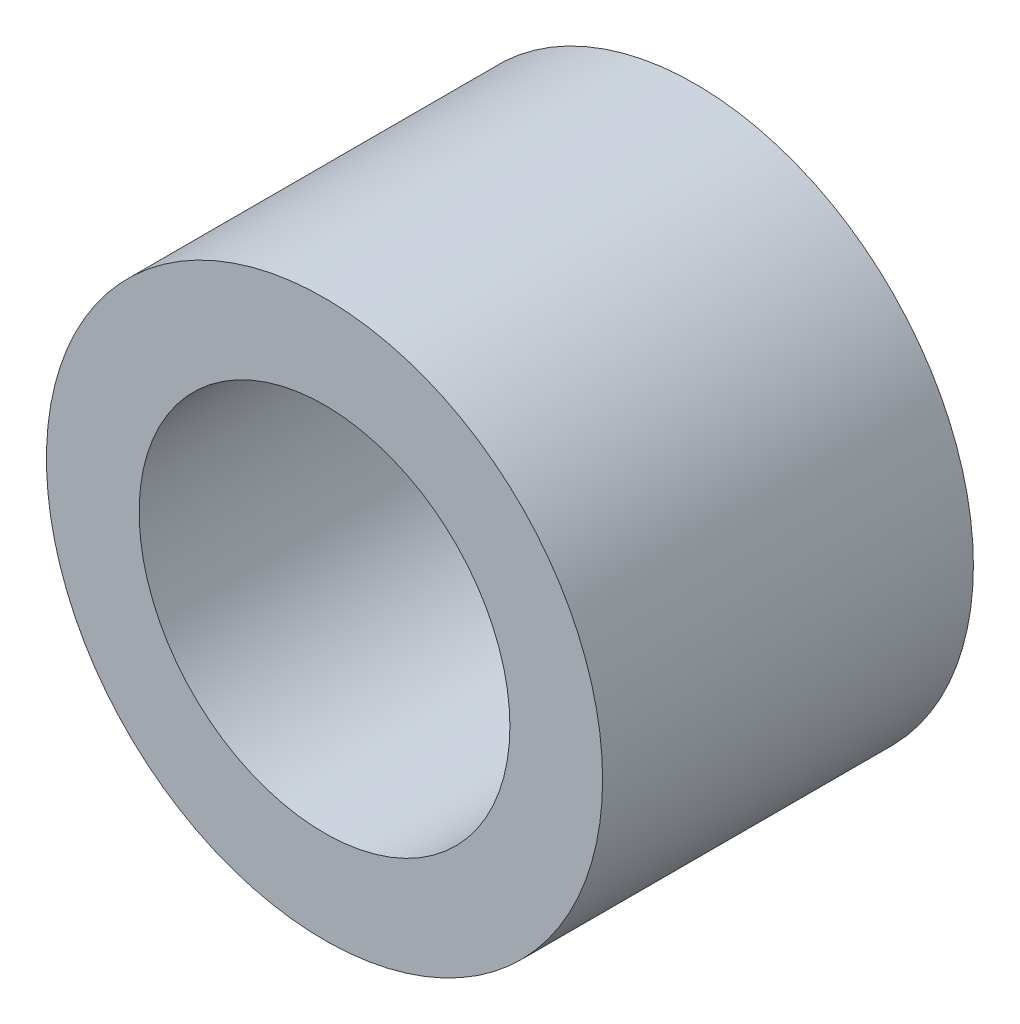
ISO-10303-21;
HEADER;
FILE_DESCRIPTION(('STEP AP214'),'2;1');
FILE_NAME('part.step','',(''),(''),'','','');
FILE_SCHEMA(('AUTOMOTIVE_DESIGN { 1 0 10303 214 1 1 1 1 }'));
ENDSEC;
DATA;
#1=APPLICATION_CONTEXT('core data for automotive mechanical design processes');
#2=APPLICATION_PROTOCOL_DEFINITION('international standard','automotive_design',2000,#1);
#3=PRODUCT_CONTEXT('',#1,'mechanical');
#4=PRODUCT('Part','Part','',(#3));
#5=PRODUCT_RELATED_PRODUCT_CATEGORY('part','',(#4));
#6=PRODUCT_DEFINITION_FORMATION('','',#4);
#7=PRODUCT_DEFINITION_CONTEXT('part definition',#1,'design');
#8=PRODUCT_DEFINITION('design','',#6,#7);
#9=PRODUCT_DEFINITION_SHAPE('','',#8);
#10=(LENGTH_UNIT() NAMED_UNIT(*) SI_UNIT(.MILLI.,.METRE.));
#11=(NAMED_UNIT(*) PLANE_ANGLE_UNIT() SI_UNIT($,.RADIAN.));
#12=(NAMED_UNIT(*) SI_UNIT($,.STERADIAN.) SOLID_ANGLE_UNIT());
#13=UNCERTAINTY_MEASURE_WITH_UNIT(LENGTH_MEASURE(1.E-05),#10,'distance_accuracy_value','');
#14=(GEOMETRIC_REPRESENTATION_CONTEXT(3) GLOBAL_UNCERTAINTY_ASSIGNED_CONTEXT((#13)) GLOBAL_UNIT_ASSIGNED_CONTEXT((#10,
#11,#12)) REPRESENTATION_CONTEXT('',''));
#15=CARTESIAN_POINT('',(0.,0.,0.));
#16=DIRECTION('',(0.,0.,1.));
#17=DIRECTION('',(1.,0.,0.));
#18=AXIS2_PLACEMENT_3D('',#15,#16,#17);
#19=CARTESIAN_POINT('',(0.,8.88178419700125E-13,2.));
#20=DIRECTION('',(0.,0.,1.));
#21=DIRECTION('',(1.,0.,0.));
#22=AXIS2_PLACEMENT_3D('',#19,#20,#21);
#23=PLANE('',#22);
#24=CARTESIAN_POINT('',(0.,8.88178419700125E-13,2.));
#25=DIRECTION('',(0.,0.,1.));
#26=DIRECTION('',(1.,0.,0.));
#27=AXIS2_PLACEMENT_3D('',#24,#25,#26);
#28=CIRCLE('',#27,3.);
#29=CARTESIAN_POINT('',(3.,8.87345752431656E-13,2.));
#30=VERTEX_POINT('',#29);
#31=EDGE_CURVE('E10',#30,#30,#28,.T.);
#32=ORIENTED_EDGE('',*,*,#31,.T.);
#33=EDGE_LOOP('',(#32));
#34=FACE_BOUND('',#33,.T.);
#35=CARTESIAN_POINT('',(0.,8.88178419700125E-13,2.));
#36=DIRECTION('',(0.,0.,1.));
#37=DIRECTION('',(1.,0.,0.));
#38=AXIS2_PLACEMENT_3D('',#35,#36,#37);
#39=CIRCLE('',#38,2.);
#40=CARTESIAN_POINT('',(2.,8.87623308187813E-13,2.));
#41=VERTEX_POINT('',#40);
#42=EDGE_CURVE('E60',#41,#41,#39,.T.);
#43=ORIENTED_EDGE('',*,*,#42,.F.);
#44=EDGE_LOOP('',(#43));
#45=FACE_BOUND('',#44,.T.);
#46=ADVANCED_FACE('F45',(#34,#45),#23,.T.);
#47=CARTESIAN_POINT('',(0.,0.,-2.));
#48=DIRECTION('',(0.,0.,1.));
#49=DIRECTION('',(1.,0.,0.));
#50=AXIS2_PLACEMENT_3D('',#47,#48,#49);
#51=PLANE('',#50);
#52=CARTESIAN_POINT('',(0.,0.,-2.));
#53=DIRECTION('',(0.,0.,1.));
#54=DIRECTION('',(1.,0.,0.));
#55=AXIS2_PLACEMENT_3D('',#52,#53,#54);
#56=CIRCLE('',#55,3.);
#57=CARTESIAN_POINT('',(3.,0.,-2.));
#58=VERTEX_POINT('',#57);
#59=EDGE_CURVE('E49',#58,#58,#56,.T.);
#60=ORIENTED_EDGE('',*,*,#59,.F.);
#61=EDGE_LOOP('',(#60));
#62=FACE_BOUND('',#61,.T.);
#63=CARTESIAN_POINT('',(0.,0.,-2.));
#64=DIRECTION('',(0.,0.,1.));
#65=DIRECTION('',(1.,0.,0.));
#66=AXIS2_PLACEMENT_3D('',#63,#64,#65);
#67=CIRCLE('',#66,2.);
#68=CARTESIAN_POINT('',(2.,0.,-2.));
#69=VERTEX_POINT('',#68);
#70=EDGE_CURVE('E62',#69,#69,#67,.T.);
#71=ORIENTED_EDGE('',*,*,#70,.T.);
#72=EDGE_LOOP('',(#71));
#73=FACE_BOUND('',#72,.T.);
#74=ADVANCED_FACE('F76',(#62,#73),#51,.F.);
#75=CARTESIAN_POINT('',(0.,8.88178419700125E-13,2.));
#76=DIRECTION('',(0.,0.,-1.));
#77=DIRECTION('',(-1.,0.,0.));
#78=AXIS2_PLACEMENT_3D('',#75,#76,#77);
#79=CYLINDRICAL_SURFACE('',#78,3.);
#80=ORIENTED_EDGE('',*,*,#31,.F.);
#81=EDGE_LOOP('',(#80));
#82=FACE_BOUND('',#81,.T.);
#83=ORIENTED_EDGE('',*,*,#59,.T.);
#84=EDGE_LOOP('',(#83));
#85=FACE_BOUND('',#84,.T.);
#86=ADVANCED_FACE('F47',(#82,#85),#79,.T.);
#87=CARTESIAN_POINT('',(0.,8.88178419700125E-13,2.));
#88=DIRECTION('',(0.,0.,-1.));
#89=DIRECTION('',(-1.,0.,0.));
#90=AXIS2_PLACEMENT_3D('',#87,#88,#89);
#91=CYLINDRICAL_SURFACE('',#90,2.);
#92=ORIENTED_EDGE('',*,*,#42,.T.);
#93=EDGE_LOOP('',(#92));
#94=FACE_BOUND('',#93,.T.);
#95=ORIENTED_EDGE('',*,*,#70,.F.);
#96=EDGE_LOOP('',(#95));
#97=FACE_BOUND('',#96,.T.);
#98=ADVANCED_FACE('F72',(#94,#97),#91,.F.);
#99=CLOSED_SHELL('',(#46,#74,#86,#98));
#100=MANIFOLD_SOLID_BREP('B2',#99);
#101=ADVANCED_BREP_SHAPE_REPRESENTATION('',(#18,#100),#14);
#102=SHAPE_DEFINITION_REPRESENTATION(#9,#101);
ENDSEC;
END-ISO-10303-21;
